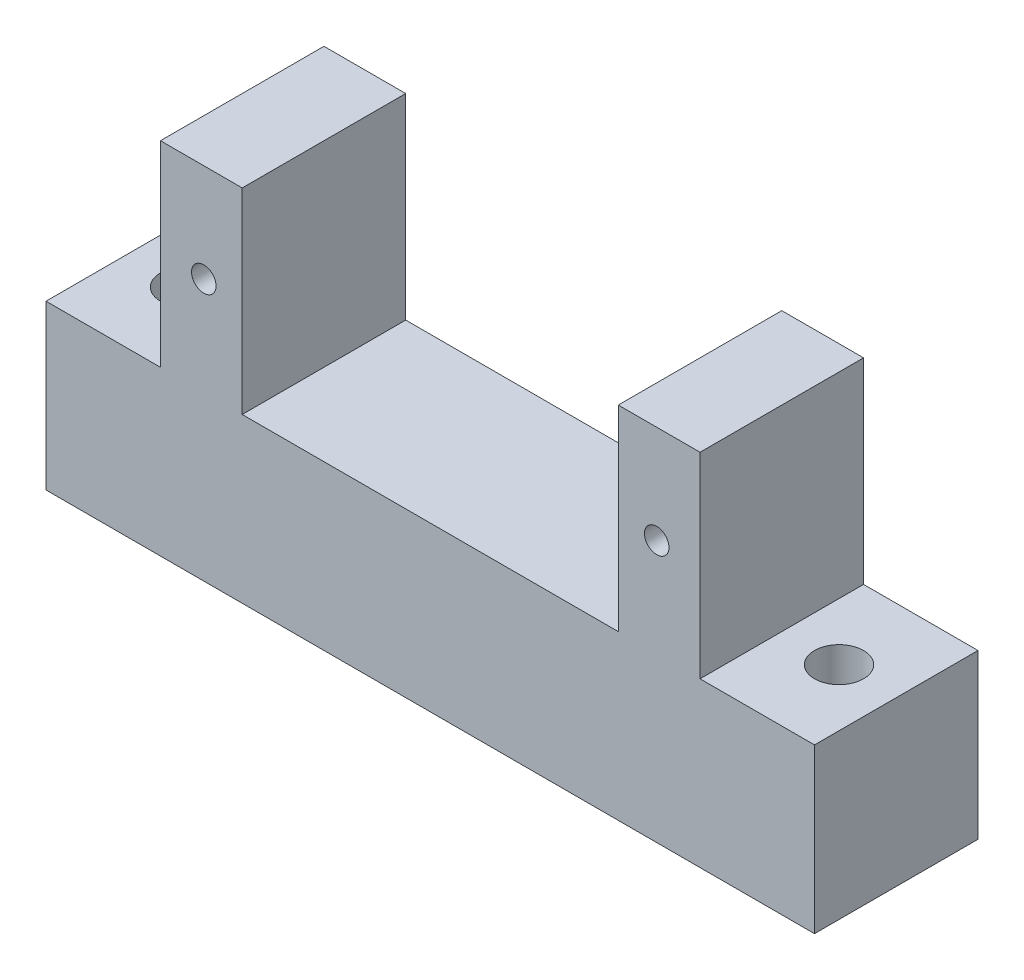
ISO-10303-21;
HEADER;
FILE_DESCRIPTION(('STEP AP214'),'2;1');
FILE_NAME('part.step','',(''),(''),'','','');
FILE_SCHEMA(('AUTOMOTIVE_DESIGN { 1 0 10303 214 1 1 1 1 }'));
ENDSEC;
DATA;
#1=APPLICATION_CONTEXT('core data for automotive mechanical design processes');
#2=APPLICATION_PROTOCOL_DEFINITION('international standard','automotive_design',2000,#1);
#3=PRODUCT_CONTEXT('',#1,'mechanical');
#4=PRODUCT('Part','Part','',(#3));
#5=PRODUCT_RELATED_PRODUCT_CATEGORY('part','',(#4));
#6=PRODUCT_DEFINITION_FORMATION('','',#4);
#7=PRODUCT_DEFINITION_CONTEXT('part definition',#1,'design');
#8=PRODUCT_DEFINITION('design','',#6,#7);
#9=PRODUCT_DEFINITION_SHAPE('','',#8);
#10=(LENGTH_UNIT() NAMED_UNIT(*) SI_UNIT(.MILLI.,.METRE.));
#11=(NAMED_UNIT(*) PLANE_ANGLE_UNIT() SI_UNIT($,.RADIAN.));
#12=(NAMED_UNIT(*) SI_UNIT($,.STERADIAN.) SOLID_ANGLE_UNIT());
#13=UNCERTAINTY_MEASURE_WITH_UNIT(LENGTH_MEASURE(1.E-05),#10,'distance_accuracy_value','');
#14=(GEOMETRIC_REPRESENTATION_CONTEXT(3) GLOBAL_UNCERTAINTY_ASSIGNED_CONTEXT((#13)) GLOBAL_UNIT_ASSIGNED_CONTEXT((#10,
#11,#12)) REPRESENTATION_CONTEXT('',''));
#15=CARTESIAN_POINT('',(0.,0.,0.));
#16=DIRECTION('',(0.,0.,1.));
#17=DIRECTION('',(1.,0.,0.));
#18=AXIS2_PLACEMENT_3D('',#15,#16,#17);
#19=CARTESIAN_POINT('',(16.5,-7.,0.));
#20=DIRECTION('',(-1.,0.,0.));
#21=DIRECTION('',(0.,0.,1.));
#22=AXIS2_PLACEMENT_3D('',#19,#20,#21);
#23=PLANE('',#22);
#24=DIRECTION('',(0.,0.,1.));
#25=VECTOR('',#24,1.);
#26=CARTESIAN_POINT('',(16.5,3.,0.));
#27=LINE('',#26,#25);
#28=CARTESIAN_POINT('',(16.5,3.,0.));
#29=VERTEX_POINT('',#28);
#30=CARTESIAN_POINT('',(16.5,3.,10.));
#31=VERTEX_POINT('',#30);
#32=EDGE_CURVE('E63',#29,#31,#27,.T.);
#33=ORIENTED_EDGE('',*,*,#32,.F.);
#34=DIRECTION('',(0.,1.,0.));
#35=VECTOR('',#34,1.);
#36=CARTESIAN_POINT('',(16.5,-7.,0.));
#37=LINE('',#36,#35);
#38=CARTESIAN_POINT('',(16.5,15.,0.));
#39=VERTEX_POINT('',#38);
#40=EDGE_CURVE('E162',#29,#39,#37,.T.);
#41=ORIENTED_EDGE('',*,*,#40,.T.);
#42=DIRECTION('',(0.,0.,1.));
#43=VECTOR('',#42,1.);
#44=CARTESIAN_POINT('',(16.5,15.,0.));
#45=LINE('',#44,#43);
#46=CARTESIAN_POINT('',(16.5,15.,10.));
#47=VERTEX_POINT('',#46);
#48=EDGE_CURVE('E178',#39,#47,#45,.T.);
#49=ORIENTED_EDGE('',*,*,#48,.T.);
#50=DIRECTION('',(0.,1.,0.));
#51=VECTOR('',#50,1.);
#52=CARTESIAN_POINT('',(16.5,-7.,10.));
#53=LINE('',#52,#51);
#54=EDGE_CURVE('E194',#31,#47,#53,.T.);
#55=ORIENTED_EDGE('',*,*,#54,.F.);
#56=EDGE_LOOP('',(#33,#41,#49,#55));
#57=FACE_BOUND('',#56,.T.);
#58=ADVANCED_FACE('F45',(#57),#23,.F.);
#59=CARTESIAN_POINT('',(-11.5,-7.,0.));
#60=DIRECTION('',(-1.,0.,0.));
#61=DIRECTION('',(0.,0.,1.));
#62=AXIS2_PLACEMENT_3D('',#59,#60,#61);
#63=PLANE('',#62);
#64=DIRECTION('',(0.,0.,1.));
#65=VECTOR('',#64,1.);
#66=CARTESIAN_POINT('',(-11.5,3.,0.));
#67=LINE('',#66,#65);
#68=CARTESIAN_POINT('',(-11.5,3.,0.));
#69=VERTEX_POINT('',#68);
#70=CARTESIAN_POINT('',(-11.5,3.,10.));
#71=VERTEX_POINT('',#70);
#72=EDGE_CURVE('E71',#69,#71,#67,.T.);
#73=ORIENTED_EDGE('',*,*,#72,.F.);
#74=DIRECTION('',(0.,1.,0.));
#75=VECTOR('',#74,1.);
#76=CARTESIAN_POINT('',(-11.5,-7.,0.));
#77=LINE('',#76,#75);
#78=CARTESIAN_POINT('',(-11.5,15.,0.));
#79=VERTEX_POINT('',#78);
#80=EDGE_CURVE('E235',#69,#79,#77,.T.);
#81=ORIENTED_EDGE('',*,*,#80,.T.);
#82=DIRECTION('',(0.,0.,1.));
#83=VECTOR('',#82,1.);
#84=CARTESIAN_POINT('',(-11.5,15.,0.));
#85=LINE('',#84,#83);
#86=CARTESIAN_POINT('',(-11.5,15.,10.));
#87=VERTEX_POINT('',#86);
#88=EDGE_CURVE('E230',#79,#87,#85,.T.);
#89=ORIENTED_EDGE('',*,*,#88,.T.);
#90=DIRECTION('',(0.,1.,0.));
#91=VECTOR('',#90,1.);
#92=CARTESIAN_POINT('',(-11.5,-7.,10.));
#93=LINE('',#92,#91);
#94=EDGE_CURVE('E239',#71,#87,#93,.T.);
#95=ORIENTED_EDGE('',*,*,#94,.F.);
#96=EDGE_LOOP('',(#73,#81,#89,#95));
#97=FACE_BOUND('',#96,.T.);
#98=ADVANCED_FACE('F318',(#97),#63,.F.);
#99=CARTESIAN_POINT('',(0.,-7.,0.));
#100=DIRECTION('',(0.,0.,-1.));
#101=DIRECTION('',(-1.,0.,0.));
#102=AXIS2_PLACEMENT_3D('',#99,#100,#101);
#103=PLANE('',#102);
#104=CARTESIAN_POINT('',(13.85,9.,0.));
#105=DIRECTION('',(0.,0.,-1.));
#106=DIRECTION('',(-1.,0.,0.));
#107=AXIS2_PLACEMENT_3D('',#104,#105,#106);
#108=CIRCLE('',#107,0.75);
#109=CARTESIAN_POINT('',(13.1,9.,0.));
#110=VERTEX_POINT('',#109);
#111=EDGE_CURVE('E284',#110,#110,#108,.T.);
#112=ORIENTED_EDGE('',*,*,#111,.F.);
#113=EDGE_LOOP('',(#112));
#114=FACE_BOUND('',#113,.T.);
#115=CARTESIAN_POINT('',(-13.85,9.,0.));
#116=DIRECTION('',(0.,0.,-1.));
#117=DIRECTION('',(-1.,0.,0.));
#118=AXIS2_PLACEMENT_3D('',#115,#116,#117);
#119=CIRCLE('',#118,0.75);
#120=CARTESIAN_POINT('',(-14.6,9.,0.));
#121=VERTEX_POINT('',#120);
#122=EDGE_CURVE('E291',#121,#121,#119,.T.);
#123=ORIENTED_EDGE('',*,*,#122,.F.);
#124=EDGE_LOOP('',(#123));
#125=FACE_BOUND('',#124,.T.);
#126=DIRECTION('',(0.,1.,0.));
#127=VECTOR('',#126,1.);
#128=CARTESIAN_POINT('',(-23.5,-7.,0.));
#129=LINE('',#128,#127);
#130=CARTESIAN_POINT('',(-23.5,-7.,0.));
#131=VERTEX_POINT('',#130);
#132=CARTESIAN_POINT('',(-23.5,3.,0.));
#133=VERTEX_POINT('',#132);
#134=EDGE_CURVE('E55',#131,#133,#129,.T.);
#135=ORIENTED_EDGE('',*,*,#134,.T.);
#136=DIRECTION('',(-1.,0.,0.));
#137=VECTOR('',#136,1.);
#138=CARTESIAN_POINT('',(0.,3.,0.));
#139=LINE('',#138,#137);
#140=CARTESIAN_POINT('',(-16.5,3.,0.));
#141=VERTEX_POINT('',#140);
#142=EDGE_CURVE('E250',#141,#133,#139,.T.);
#143=ORIENTED_EDGE('',*,*,#142,.F.);
#144=DIRECTION('',(0.,1.,0.));
#145=VECTOR('',#144,1.);
#146=CARTESIAN_POINT('',(-16.5,-7.,0.));
#147=LINE('',#146,#145);
#148=CARTESIAN_POINT('',(-16.5,15.,0.));
#149=VERTEX_POINT('',#148);
#150=EDGE_CURVE('E234',#141,#149,#147,.T.);
#151=ORIENTED_EDGE('',*,*,#150,.T.);
#152=DIRECTION('',(-1.,0.,0.));
#153=VECTOR('',#152,1.);
#154=CARTESIAN_POINT('',(0.,15.,0.));
#155=LINE('',#154,#153);
#156=EDGE_CURVE('E218',#79,#149,#155,.T.);
#157=ORIENTED_EDGE('',*,*,#156,.F.);
#158=ORIENTED_EDGE('',*,*,#80,.F.);
#159=DIRECTION('',(1.,0.,0.));
#160=VECTOR('',#159,1.);
#161=CARTESIAN_POINT('',(0.,3.,0.));
#162=LINE('',#161,#160);
#163=CARTESIAN_POINT('',(11.5,3.,0.));
#164=VERTEX_POINT('',#163);
#165=EDGE_CURVE('E209',#69,#164,#162,.T.);
#166=ORIENTED_EDGE('',*,*,#165,.T.);
#167=DIRECTION('',(0.,1.,0.));
#168=VECTOR('',#167,1.);
#169=CARTESIAN_POINT('',(11.5,-7.,0.));
#170=LINE('',#169,#168);
#171=CARTESIAN_POINT('',(11.5,15.,0.));
#172=VERTEX_POINT('',#171);
#173=EDGE_CURVE('E201',#164,#172,#170,.T.);
#174=ORIENTED_EDGE('',*,*,#173,.T.);
#175=DIRECTION('',(1.,0.,0.));
#176=VECTOR('',#175,1.);
#177=CARTESIAN_POINT('',(0.,15.,0.));
#178=LINE('',#177,#176);
#179=EDGE_CURVE('E183',#172,#39,#178,.T.);
#180=ORIENTED_EDGE('',*,*,#179,.T.);
#181=ORIENTED_EDGE('',*,*,#40,.F.);
#182=DIRECTION('',(1.,0.,0.));
#183=VECTOR('',#182,1.);
#184=CARTESIAN_POINT('',(0.,3.,0.));
#185=LINE('',#184,#183);
#186=CARTESIAN_POINT('',(23.5,3.,0.));
#187=VERTEX_POINT('',#186);
#188=EDGE_CURVE('E154',#29,#187,#185,.T.);
#189=ORIENTED_EDGE('',*,*,#188,.T.);
#190=DIRECTION('',(0.,1.,0.));
#191=VECTOR('',#190,1.);
#192=CARTESIAN_POINT('',(23.5,-7.,0.));
#193=LINE('',#192,#191);
#194=CARTESIAN_POINT('',(23.5,-7.,0.));
#195=VERTEX_POINT('',#194);
#196=EDGE_CURVE('E137',#195,#187,#193,.T.);
#197=ORIENTED_EDGE('',*,*,#196,.F.);
#198=DIRECTION('',(-1.,0.,0.));
#199=VECTOR('',#198,1.);
#200=CARTESIAN_POINT('',(0.,-7.,0.));
#201=LINE('',#200,#199);
#202=EDGE_CURVE('E270',#195,#131,#201,.T.);
#203=ORIENTED_EDGE('',*,*,#202,.T.);
#204=EDGE_LOOP('',(#135,#143,#151,#157,#158,#166,#174,#180,#181,#189,#197,#203));
#205=FACE_BOUND('',#204,.T.);
#206=ADVANCED_FACE('F160',(#114,#125,#205),#103,.T.);
#207=CARTESIAN_POINT('',(0.,-7.,10.));
#208=DIRECTION('',(0.,0.,-1.));
#209=DIRECTION('',(-1.,0.,0.));
#210=AXIS2_PLACEMENT_3D('',#207,#208,#209);
#211=PLANE('',#210);
#212=CARTESIAN_POINT('',(13.85,9.,10.));
#213=DIRECTION('',(0.,0.,-1.));
#214=DIRECTION('',(-1.,0.,0.));
#215=AXIS2_PLACEMENT_3D('',#212,#213,#214);
#216=CIRCLE('',#215,0.75);
#217=CARTESIAN_POINT('',(13.1,9.,10.));
#218=VERTEX_POINT('',#217);
#219=EDGE_CURVE('E49',#218,#218,#216,.T.);
#220=ORIENTED_EDGE('',*,*,#219,.T.);
#221=EDGE_LOOP('',(#220));
#222=FACE_BOUND('',#221,.T.);
#223=CARTESIAN_POINT('',(-13.85,9.,10.));
#224=DIRECTION('',(0.,0.,-1.));
#225=DIRECTION('',(-1.,0.,0.));
#226=AXIS2_PLACEMENT_3D('',#223,#224,#225);
#227=CIRCLE('',#226,0.75);
#228=CARTESIAN_POINT('',(-14.6,9.,10.));
#229=VERTEX_POINT('',#228);
#230=EDGE_CURVE('E281',#229,#229,#227,.T.);
#231=ORIENTED_EDGE('',*,*,#230,.T.);
#232=EDGE_LOOP('',(#231));
#233=FACE_BOUND('',#232,.T.);
#234=DIRECTION('',(-1.,0.,0.));
#235=VECTOR('',#234,1.);
#236=CARTESIAN_POINT('',(0.,-7.,10.));
#237=LINE('',#236,#235);
#238=CARTESIAN_POINT('',(23.5,-7.,10.));
#239=VERTEX_POINT('',#238);
#240=CARTESIAN_POINT('',(-23.5,-7.,10.));
#241=VERTEX_POINT('',#240);
#242=EDGE_CURVE('E277',#239,#241,#237,.T.);
#243=ORIENTED_EDGE('',*,*,#242,.F.);
#244=DIRECTION('',(0.,1.,0.));
#245=VECTOR('',#244,1.);
#246=CARTESIAN_POINT('',(23.5,-7.,10.));
#247=LINE('',#246,#245);
#248=CARTESIAN_POINT('',(23.5,3.,10.));
#249=VERTEX_POINT('',#248);
#250=EDGE_CURVE('E148',#239,#249,#247,.T.);
#251=ORIENTED_EDGE('',*,*,#250,.T.);
#252=DIRECTION('',(1.,0.,0.));
#253=VECTOR('',#252,1.);
#254=CARTESIAN_POINT('',(0.,3.,10.));
#255=LINE('',#254,#253);
#256=EDGE_CURVE('E156',#31,#249,#255,.T.);
#257=ORIENTED_EDGE('',*,*,#256,.F.);
#258=ORIENTED_EDGE('',*,*,#54,.T.);
#259=DIRECTION('',(1.,0.,0.));
#260=VECTOR('',#259,1.);
#261=CARTESIAN_POINT('',(0.,15.,10.));
#262=LINE('',#261,#260);
#263=CARTESIAN_POINT('',(11.5,15.,10.));
#264=VERTEX_POINT('',#263);
#265=EDGE_CURVE('E190',#264,#47,#262,.T.);
#266=ORIENTED_EDGE('',*,*,#265,.F.);
#267=DIRECTION('',(0.,1.,0.));
#268=VECTOR('',#267,1.);
#269=CARTESIAN_POINT('',(11.5,-7.,10.));
#270=LINE('',#269,#268);
#271=CARTESIAN_POINT('',(11.5,3.,10.));
#272=VERTEX_POINT('',#271);
#273=EDGE_CURVE('E198',#272,#264,#270,.T.);
#274=ORIENTED_EDGE('',*,*,#273,.F.);
#275=DIRECTION('',(1.,0.,0.));
#276=VECTOR('',#275,1.);
#277=CARTESIAN_POINT('',(0.,3.,10.));
#278=LINE('',#277,#276);
#279=EDGE_CURVE('E215',#71,#272,#278,.T.);
#280=ORIENTED_EDGE('',*,*,#279,.F.);
#281=ORIENTED_EDGE('',*,*,#94,.T.);
#282=DIRECTION('',(-1.,0.,0.));
#283=VECTOR('',#282,1.);
#284=CARTESIAN_POINT('',(0.,15.,10.));
#285=LINE('',#284,#283);
#286=CARTESIAN_POINT('',(-16.5,15.,10.));
#287=VERTEX_POINT('',#286);
#288=EDGE_CURVE('E226',#87,#287,#285,.T.);
#289=ORIENTED_EDGE('',*,*,#288,.T.);
#290=DIRECTION('',(0.,1.,0.));
#291=VECTOR('',#290,1.);
#292=CARTESIAN_POINT('',(-16.5,-7.,10.));
#293=LINE('',#292,#291);
#294=CARTESIAN_POINT('',(-16.5,3.,10.));
#295=VERTEX_POINT('',#294);
#296=EDGE_CURVE('E242',#295,#287,#293,.T.);
#297=ORIENTED_EDGE('',*,*,#296,.F.);
#298=DIRECTION('',(-1.,0.,0.));
#299=VECTOR('',#298,1.);
#300=CARTESIAN_POINT('',(0.,3.,10.));
#301=LINE('',#300,#299);
#302=CARTESIAN_POINT('',(-23.5,3.,10.));
#303=VERTEX_POINT('',#302);
#304=EDGE_CURVE('E258',#295,#303,#301,.T.);
#305=ORIENTED_EDGE('',*,*,#304,.T.);
#306=DIRECTION('',(0.,1.,0.));
#307=VECTOR('',#306,1.);
#308=CARTESIAN_POINT('',(-23.5,-7.,10.));
#309=LINE('',#308,#307);
#310=EDGE_CURVE('E11',#241,#303,#309,.T.);
#311=ORIENTED_EDGE('',*,*,#310,.F.);
#312=EDGE_LOOP('',(#243,#251,#257,#258,#266,#274,#280,#281,#289,#297,#305,#311));
#313=FACE_BOUND('',#312,.T.);
#314=ADVANCED_FACE('F349',(#222,#233,#313),#211,.F.);
#315=CARTESIAN_POINT('',(-20.,-7.,5.));
#316=DIRECTION('',(0.,1.,0.));
#317=DIRECTION('',(0.,0.,1.));
#318=AXIS2_PLACEMENT_3D('',#315,#316,#317);
#319=CYLINDRICAL_SURFACE('',#318,1.5);
#320=CARTESIAN_POINT('',(-20.,-7.,5.));
#321=DIRECTION('',(0.,1.,0.));
#322=DIRECTION('',(0.,0.,1.));
#323=AXIS2_PLACEMENT_3D('',#320,#321,#322);
#324=CIRCLE('',#323,1.5);
#325=CARTESIAN_POINT('',(-20.,-7.,6.5));
#326=VERTEX_POINT('',#325);
#327=EDGE_CURVE('E266',#326,#326,#324,.T.);
#328=ORIENTED_EDGE('',*,*,#327,.F.);
#329=EDGE_LOOP('',(#328));
#330=FACE_BOUND('',#329,.T.);
#331=CARTESIAN_POINT('',(-20.,3.,5.));
#332=DIRECTION('',(0.,1.,0.));
#333=DIRECTION('',(0.,0.,1.));
#334=AXIS2_PLACEMENT_3D('',#331,#332,#333);
#335=CIRCLE('',#334,1.5);
#336=CARTESIAN_POINT('',(-20.,3.,6.5));
#337=VERTEX_POINT('',#336);
#338=EDGE_CURVE('E238',#337,#337,#335,.T.);
#339=ORIENTED_EDGE('',*,*,#338,.T.);
#340=EDGE_LOOP('',(#339));
#341=FACE_BOUND('',#340,.T.);
#342=ADVANCED_FACE('F47',(#330,#341),#319,.F.);
#343=CARTESIAN_POINT('',(-23.5,-7.,0.));
#344=DIRECTION('',(-1.,0.,0.));
#345=DIRECTION('',(0.,0.,1.));
#346=AXIS2_PLACEMENT_3D('',#343,#344,#345);
#347=PLANE('',#346);
#348=ORIENTED_EDGE('',*,*,#310,.T.);
#349=DIRECTION('',(0.,0.,1.));
#350=VECTOR('',#349,1.);
#351=CARTESIAN_POINT('',(-23.5,3.,0.));
#352=LINE('',#351,#350);
#353=EDGE_CURVE('E254',#133,#303,#352,.T.);
#354=ORIENTED_EDGE('',*,*,#353,.F.);
#355=ORIENTED_EDGE('',*,*,#134,.F.);
#356=DIRECTION('',(0.,0.,1.));
#357=VECTOR('',#356,1.);
#358=CARTESIAN_POINT('',(-23.5,-7.,0.));
#359=LINE('',#358,#357);
#360=EDGE_CURVE('E273',#131,#241,#359,.T.);
#361=ORIENTED_EDGE('',*,*,#360,.T.);
#362=EDGE_LOOP('',(#348,#354,#355,#361));
#363=FACE_BOUND('',#362,.T.);
#364=ADVANCED_FACE('F347',(#363),#347,.T.);
#365=CARTESIAN_POINT('',(0.,-7.,0.));
#366=DIRECTION('',(0.,1.,0.));
#367=DIRECTION('',(0.,0.,1.));
#368=AXIS2_PLACEMENT_3D('',#365,#366,#367);
#369=PLANE('',#368);
#370=ORIENTED_EDGE('',*,*,#327,.T.);
#371=EDGE_LOOP('',(#370));
#372=FACE_BOUND('',#371,.T.);
#373=ORIENTED_EDGE('',*,*,#202,.F.);
#374=DIRECTION('',(0.,0.,1.));
#375=VECTOR('',#374,1.);
#376=CARTESIAN_POINT('',(23.5,-7.,0.));
#377=LINE('',#376,#375);
#378=EDGE_CURVE('E143',#195,#239,#377,.T.);
#379=ORIENTED_EDGE('',*,*,#378,.T.);
#380=ORIENTED_EDGE('',*,*,#242,.T.);
#381=ORIENTED_EDGE('',*,*,#360,.F.);
#382=EDGE_LOOP('',(#373,#379,#380,#381));
#383=FACE_BOUND('',#382,.T.);
#384=CARTESIAN_POINT('',(20.,-7.,5.));
#385=DIRECTION('',(0.,1.,0.));
#386=DIRECTION('',(0.,0.,1.));
#387=AXIS2_PLACEMENT_3D('',#384,#385,#386);
#388=CIRCLE('',#387,1.5);
#389=CARTESIAN_POINT('',(20.,-7.,6.5));
#390=VERTEX_POINT('',#389);
#391=EDGE_CURVE('E171',#390,#390,#388,.T.);
#392=ORIENTED_EDGE('',*,*,#391,.T.);
#393=EDGE_LOOP('',(#392));
#394=FACE_BOUND('',#393,.T.);
#395=ADVANCED_FACE('F343',(#372,#383,#394),#369,.F.);
#396=CARTESIAN_POINT('',(0.,3.,0.));
#397=DIRECTION('',(0.,1.,0.));
#398=DIRECTION('',(0.,0.,1.));
#399=AXIS2_PLACEMENT_3D('',#396,#397,#398);
#400=PLANE('',#399);
#401=ORIENTED_EDGE('',*,*,#338,.F.);
#402=EDGE_LOOP('',(#401));
#403=FACE_BOUND('',#402,.T.);
#404=ORIENTED_EDGE('',*,*,#142,.T.);
#405=ORIENTED_EDGE('',*,*,#353,.T.);
#406=ORIENTED_EDGE('',*,*,#304,.F.);
#407=DIRECTION('',(0.,0.,1.));
#408=VECTOR('',#407,1.);
#409=CARTESIAN_POINT('',(-16.5,3.,0.));
#410=LINE('',#409,#408);
#411=EDGE_CURVE('E262',#141,#295,#410,.T.);
#412=ORIENTED_EDGE('',*,*,#411,.F.);
#413=EDGE_LOOP('',(#404,#405,#406,#412));
#414=FACE_BOUND('',#413,.T.);
#415=ADVANCED_FACE('F339',(#403,#414),#400,.T.);
#416=CARTESIAN_POINT('',(-16.5,-7.,0.));
#417=DIRECTION('',(-1.,0.,0.));
#418=DIRECTION('',(0.,0.,1.));
#419=AXIS2_PLACEMENT_3D('',#416,#417,#418);
#420=PLANE('',#419);
#421=ORIENTED_EDGE('',*,*,#150,.F.);
#422=ORIENTED_EDGE('',*,*,#411,.T.);
#423=ORIENTED_EDGE('',*,*,#296,.T.);
#424=DIRECTION('',(0.,0.,1.));
#425=VECTOR('',#424,1.);
#426=CARTESIAN_POINT('',(-16.5,15.,0.));
#427=LINE('',#426,#425);
#428=EDGE_CURVE('E222',#149,#287,#427,.T.);
#429=ORIENTED_EDGE('',*,*,#428,.F.);
#430=EDGE_LOOP('',(#421,#422,#423,#429));
#431=FACE_BOUND('',#430,.T.);
#432=ADVANCED_FACE('F334',(#431),#420,.T.);
#433=CARTESIAN_POINT('',(0.,15.,0.));
#434=DIRECTION('',(0.,1.,0.));
#435=DIRECTION('',(0.,0.,1.));
#436=AXIS2_PLACEMENT_3D('',#433,#434,#435);
#437=PLANE('',#436);
#438=ORIENTED_EDGE('',*,*,#156,.T.);
#439=ORIENTED_EDGE('',*,*,#428,.T.);
#440=ORIENTED_EDGE('',*,*,#288,.F.);
#441=ORIENTED_EDGE('',*,*,#88,.F.);
#442=EDGE_LOOP('',(#438,#439,#440,#441));
#443=FACE_BOUND('',#442,.T.);
#444=ADVANCED_FACE('F331',(#443),#437,.T.);
#445=CARTESIAN_POINT('',(0.,3.,0.));
#446=DIRECTION('',(0.,1.,0.));
#447=DIRECTION('',(0.,0.,1.));
#448=AXIS2_PLACEMENT_3D('',#445,#446,#447);
#449=PLANE('',#448);
#450=DIRECTION('',(0.,0.,1.));
#451=VECTOR('',#450,1.);
#452=CARTESIAN_POINT('',(11.5,3.,0.));
#453=LINE('',#452,#451);
#454=EDGE_CURVE('E197',#164,#272,#453,.T.);
#455=ORIENTED_EDGE('',*,*,#454,.F.);
#456=ORIENTED_EDGE('',*,*,#165,.F.);
#457=ORIENTED_EDGE('',*,*,#72,.T.);
#458=ORIENTED_EDGE('',*,*,#279,.T.);
#459=EDGE_LOOP('',(#455,#456,#457,#458));
#460=FACE_BOUND('',#459,.T.);
#461=ADVANCED_FACE('F328',(#460),#449,.T.);
#462=CARTESIAN_POINT('',(11.5,-7.,0.));
#463=DIRECTION('',(-1.,0.,0.));
#464=DIRECTION('',(0.,0.,1.));
#465=AXIS2_PLACEMENT_3D('',#462,#463,#464);
#466=PLANE('',#465);
#467=ORIENTED_EDGE('',*,*,#173,.F.);
#468=ORIENTED_EDGE('',*,*,#454,.T.);
#469=ORIENTED_EDGE('',*,*,#273,.T.);
#470=DIRECTION('',(0.,0.,1.));
#471=VECTOR('',#470,1.);
#472=CARTESIAN_POINT('',(11.5,15.,0.));
#473=LINE('',#472,#471);
#474=EDGE_CURVE('E186',#172,#264,#473,.T.);
#475=ORIENTED_EDGE('',*,*,#474,.F.);
#476=EDGE_LOOP('',(#467,#468,#469,#475));
#477=FACE_BOUND('',#476,.T.);
#478=ADVANCED_FACE('F326',(#477),#466,.T.);
#479=CARTESIAN_POINT('',(0.,15.,0.));
#480=DIRECTION('',(0.,1.,0.));
#481=DIRECTION('',(0.,0.,1.));
#482=AXIS2_PLACEMENT_3D('',#479,#480,#481);
#483=PLANE('',#482);
#484=ORIENTED_EDGE('',*,*,#48,.F.);
#485=ORIENTED_EDGE('',*,*,#179,.F.);
#486=ORIENTED_EDGE('',*,*,#474,.T.);
#487=ORIENTED_EDGE('',*,*,#265,.T.);
#488=EDGE_LOOP('',(#484,#485,#486,#487));
#489=FACE_BOUND('',#488,.T.);
#490=ADVANCED_FACE('F405',(#489),#483,.T.);
#491=CARTESIAN_POINT('',(23.5,-7.,0.));
#492=DIRECTION('',(-1.,0.,0.));
#493=DIRECTION('',(0.,0.,1.));
#494=AXIS2_PLACEMENT_3D('',#491,#492,#493);
#495=PLANE('',#494);
#496=ORIENTED_EDGE('',*,*,#196,.T.);
#497=DIRECTION('',(0.,0.,1.));
#498=VECTOR('',#497,1.);
#499=CARTESIAN_POINT('',(23.5,3.,0.));
#500=LINE('',#499,#498);
#501=EDGE_CURVE('E141',#187,#249,#500,.T.);
#502=ORIENTED_EDGE('',*,*,#501,.T.);
#503=ORIENTED_EDGE('',*,*,#250,.F.);
#504=ORIENTED_EDGE('',*,*,#378,.F.);
#505=EDGE_LOOP('',(#496,#502,#503,#504));
#506=FACE_BOUND('',#505,.T.);
#507=ADVANCED_FACE('F139',(#506),#495,.F.);
#508=CARTESIAN_POINT('',(20.,-7.,5.));
#509=DIRECTION('',(0.,1.,0.));
#510=DIRECTION('',(0.,0.,1.));
#511=AXIS2_PLACEMENT_3D('',#508,#509,#510);
#512=CYLINDRICAL_SURFACE('',#511,1.5);
#513=ORIENTED_EDGE('',*,*,#391,.F.);
#514=EDGE_LOOP('',(#513));
#515=FACE_BOUND('',#514,.T.);
#516=CARTESIAN_POINT('',(20.,3.,5.));
#517=DIRECTION('',(0.,1.,0.));
#518=DIRECTION('',(0.,0.,1.));
#519=AXIS2_PLACEMENT_3D('',#516,#517,#518);
#520=CIRCLE('',#519,1.5);
#521=CARTESIAN_POINT('',(20.,3.,6.5));
#522=VERTEX_POINT('',#521);
#523=EDGE_CURVE('E158',#522,#522,#520,.T.);
#524=ORIENTED_EDGE('',*,*,#523,.T.);
#525=EDGE_LOOP('',(#524));
#526=FACE_BOUND('',#525,.T.);
#527=ADVANCED_FACE('F302',(#515,#526),#512,.F.);
#528=CARTESIAN_POINT('',(0.,3.,0.));
#529=DIRECTION('',(0.,1.,0.));
#530=DIRECTION('',(0.,0.,1.));
#531=AXIS2_PLACEMENT_3D('',#528,#529,#530);
#532=PLANE('',#531);
#533=ORIENTED_EDGE('',*,*,#523,.F.);
#534=EDGE_LOOP('',(#533));
#535=FACE_BOUND('',#534,.T.);
#536=ORIENTED_EDGE('',*,*,#501,.F.);
#537=ORIENTED_EDGE('',*,*,#188,.F.);
#538=ORIENTED_EDGE('',*,*,#32,.T.);
#539=ORIENTED_EDGE('',*,*,#256,.T.);
#540=EDGE_LOOP('',(#536,#537,#538,#539));
#541=FACE_BOUND('',#540,.T.);
#542=ADVANCED_FACE('F153',(#535,#541),#532,.T.);
#543=CARTESIAN_POINT('',(-13.85,9.,15.));
#544=DIRECTION('',(0.,0.,-1.));
#545=DIRECTION('',(-1.,0.,0.));
#546=AXIS2_PLACEMENT_3D('',#543,#544,#545);
#547=CYLINDRICAL_SURFACE('',#546,0.75);
#548=ORIENTED_EDGE('',*,*,#122,.T.);
#549=EDGE_LOOP('',(#548));
#550=FACE_BOUND('',#549,.T.);
#551=ORIENTED_EDGE('',*,*,#230,.F.);
#552=EDGE_LOOP('',(#551));
#553=FACE_BOUND('',#552,.T.);
#554=ADVANCED_FACE('F305',(#550,#553),#547,.F.);
#555=CARTESIAN_POINT('',(13.85,9.,15.));
#556=DIRECTION('',(0.,0.,-1.));
#557=DIRECTION('',(-1.,0.,0.));
#558=AXIS2_PLACEMENT_3D('',#555,#556,#557);
#559=CYLINDRICAL_SURFACE('',#558,0.75);
#560=ORIENTED_EDGE('',*,*,#111,.T.);
#561=EDGE_LOOP('',(#560));
#562=FACE_BOUND('',#561,.T.);
#563=ORIENTED_EDGE('',*,*,#219,.F.);
#564=EDGE_LOOP('',(#563));
#565=FACE_BOUND('',#564,.T.);
#566=ADVANCED_FACE('F311',(#562,#565),#559,.F.);
#567=CLOSED_SHELL('',(#58,#98,#206,#314,#342,#364,#395,#415,#432,#444,#461,#478,#490,#507,#527,
#542,#554,#566));
#568=MANIFOLD_SOLID_BREP('B2',#567);
#569=ADVANCED_BREP_SHAPE_REPRESENTATION('',(#18,#568),#14);
#570=SHAPE_DEFINITION_REPRESENTATION(#9,#569);
ENDSEC;
END-ISO-10303-21;
